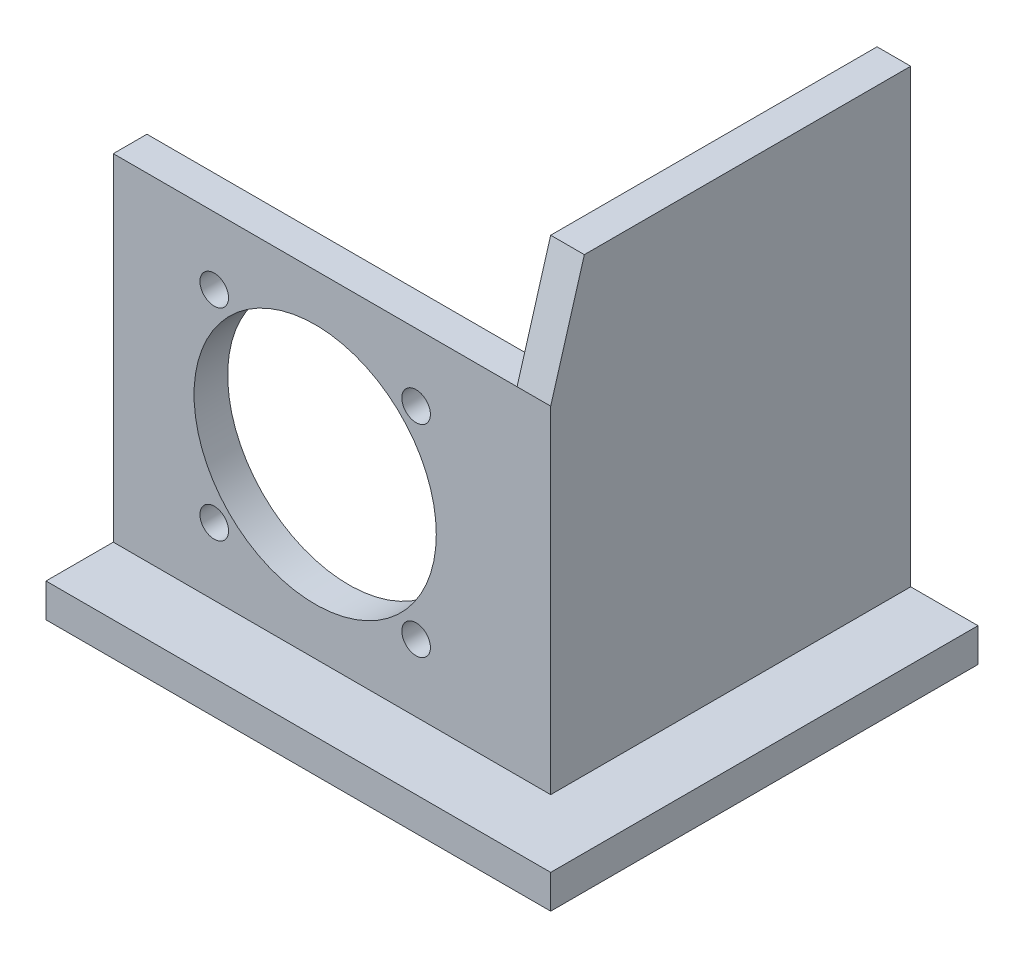
ISO-10303-21;
HEADER;
FILE_DESCRIPTION(('STEP AP214'),'2;1');
FILE_NAME('part.step','',(''),(''),'','','');
FILE_SCHEMA(('AUTOMOTIVE_DESIGN { 1 0 10303 214 1 1 1 1 }'));
ENDSEC;
DATA;
#1=APPLICATION_CONTEXT('core data for automotive mechanical design processes');
#2=APPLICATION_PROTOCOL_DEFINITION('international standard','automotive_design',2000,#1);
#3=PRODUCT_CONTEXT('',#1,'mechanical');
#4=PRODUCT('Part','Part','',(#3));
#5=PRODUCT_RELATED_PRODUCT_CATEGORY('part','',(#4));
#6=PRODUCT_DEFINITION_FORMATION('','',#4);
#7=PRODUCT_DEFINITION_CONTEXT('part definition',#1,'design');
#8=PRODUCT_DEFINITION('design','',#6,#7);
#9=PRODUCT_DEFINITION_SHAPE('','',#8);
#10=(LENGTH_UNIT() NAMED_UNIT(*) SI_UNIT(.MILLI.,.METRE.));
#11=(NAMED_UNIT(*) PLANE_ANGLE_UNIT() SI_UNIT($,.RADIAN.));
#12=(NAMED_UNIT(*) SI_UNIT($,.STERADIAN.) SOLID_ANGLE_UNIT());
#13=UNCERTAINTY_MEASURE_WITH_UNIT(LENGTH_MEASURE(1.E-05),#10,'distance_accuracy_value','');
#14=(GEOMETRIC_REPRESENTATION_CONTEXT(3) GLOBAL_UNCERTAINTY_ASSIGNED_CONTEXT((#13)) GLOBAL_UNIT_ASSIGNED_CONTEXT((#10,
#11,#12)) REPRESENTATION_CONTEXT('',''));
#15=CARTESIAN_POINT('',(0.,0.,0.));
#16=DIRECTION('',(0.,0.,1.));
#17=DIRECTION('',(1.,0.,0.));
#18=AXIS2_PLACEMENT_3D('',#15,#16,#17);
#19=CARTESIAN_POINT('',(0.,0.,10.));
#20=DIRECTION('',(0.,0.,-1.));
#21=DIRECTION('',(-1.,0.,0.));
#22=AXIS2_PLACEMENT_3D('',#19,#20,#21);
#23=PLANE('',#22);
#24=DIRECTION('',(0.,-1.,0.));
#25=VECTOR('',#24,1.);
#26=CARTESIAN_POINT('',(-90.,-90.,10.));
#27=LINE('',#26,#25);
#28=CARTESIAN_POINT('',(-90.,20.,10.));
#29=VERTEX_POINT('',#28);
#30=CARTESIAN_POINT('',(-90.,-80.,10.));
#31=VERTEX_POINT('',#30);
#32=EDGE_CURVE('E55',#29,#31,#27,.T.);
#33=ORIENTED_EDGE('',*,*,#32,.T.);
#34=DIRECTION('',(1.,0.,0.));
#35=VECTOR('',#34,1.);
#36=CARTESIAN_POINT('',(-90.,-80.,10.));
#37=LINE('',#36,#35);
#38=CARTESIAN_POINT('',(40.,-80.,10.));
#39=VERTEX_POINT('',#38);
#40=EDGE_CURVE('E154',#31,#39,#37,.T.);
#41=ORIENTED_EDGE('',*,*,#40,.T.);
#42=DIRECTION('',(0.,-1.,0.));
#43=VECTOR('',#42,1.);
#44=CARTESIAN_POINT('',(40.,-90.,10.));
#45=LINE('',#44,#43);
#46=CARTESIAN_POINT('',(40.,19.9999999999996,10.));
#47=VERTEX_POINT('',#46);
#48=EDGE_CURVE('E174',#47,#39,#45,.T.);
#49=ORIENTED_EDGE('',*,*,#48,.F.);
#50=DIRECTION('',(-1.,0.,0.));
#51=VECTOR('',#50,1.);
#52=CARTESIAN_POINT('',(0.,19.9999999999996,10.));
#53=LINE('',#52,#51);
#54=CARTESIAN_POINT('',(30.,20.,10.));
#55=VERTEX_POINT('',#54);
#56=EDGE_CURVE('E251',#47,#55,#53,.T.);
#57=ORIENTED_EDGE('',*,*,#56,.T.);
#58=DIRECTION('',(-1.,0.,0.));
#59=VECTOR('',#58,1.);
#60=CARTESIAN_POINT('',(30.,20.,10.));
#61=LINE('',#60,#59);
#62=EDGE_CURVE('E227',#55,#29,#61,.T.);
#63=ORIENTED_EDGE('',*,*,#62,.T.);
#64=EDGE_LOOP('',(#33,#41,#49,#57,#63));
#65=FACE_BOUND('',#64,.T.);
#66=CARTESIAN_POINT('',(0.,0.,10.));
#67=DIRECTION('',(0.,0.,1.));
#68=DIRECTION('',(1.,0.,0.));
#69=AXIS2_PLACEMENT_3D('',#66,#67,#68);
#70=CIRCLE('',#69,4.25);
#71=CARTESIAN_POINT('',(4.25,0.,10.));
#72=VERTEX_POINT('',#71);
#73=EDGE_CURVE('E220',#72,#72,#70,.T.);
#74=ORIENTED_EDGE('',*,*,#73,.F.);
#75=EDGE_LOOP('',(#74));
#76=FACE_BOUND('',#75,.T.);
#77=CARTESIAN_POINT('',(0.,-60.,10.));
#78=DIRECTION('',(0.,0.,1.));
#79=DIRECTION('',(1.,0.,0.));
#80=AXIS2_PLACEMENT_3D('',#77,#78,#79);
#81=CIRCLE('',#80,4.25);
#82=CARTESIAN_POINT('',(4.25,-60.,10.));
#83=VERTEX_POINT('',#82);
#84=EDGE_CURVE('E214',#83,#83,#81,.T.);
#85=ORIENTED_EDGE('',*,*,#84,.F.);
#86=EDGE_LOOP('',(#85));
#87=FACE_BOUND('',#86,.T.);
#88=CARTESIAN_POINT('',(-30.,-30.,10.));
#89=DIRECTION('',(0.,0.,1.));
#90=DIRECTION('',(1.,0.,0.));
#91=AXIS2_PLACEMENT_3D('',#88,#89,#90);
#92=CIRCLE('',#91,36.);
#93=CARTESIAN_POINT('',(6.00000000000001,-30.,10.));
#94=VERTEX_POINT('',#93);
#95=EDGE_CURVE('E207',#94,#94,#92,.T.);
#96=ORIENTED_EDGE('',*,*,#95,.F.);
#97=EDGE_LOOP('',(#96));
#98=FACE_BOUND('',#97,.T.);
#99=CARTESIAN_POINT('',(-60.,0.,10.));
#100=DIRECTION('',(0.,0.,1.));
#101=DIRECTION('',(-1.,0.,0.));
#102=AXIS2_PLACEMENT_3D('',#99,#100,#101);
#103=CIRCLE('',#102,4.25);
#104=CARTESIAN_POINT('',(-64.25,0.,10.));
#105=VERTEX_POINT('',#104);
#106=EDGE_CURVE('E201',#105,#105,#103,.T.);
#107=ORIENTED_EDGE('',*,*,#106,.F.);
#108=EDGE_LOOP('',(#107));
#109=FACE_BOUND('',#108,.T.);
#110=CARTESIAN_POINT('',(-60.,-60.,10.));
#111=DIRECTION('',(0.,0.,1.));
#112=DIRECTION('',(-1.,0.,0.));
#113=AXIS2_PLACEMENT_3D('',#110,#111,#112);
#114=CIRCLE('',#113,4.25);
#115=CARTESIAN_POINT('',(-64.25,-60.,10.));
#116=VERTEX_POINT('',#115);
#117=EDGE_CURVE('E195',#116,#116,#114,.T.);
#118=ORIENTED_EDGE('',*,*,#117,.F.);
#119=EDGE_LOOP('',(#118));
#120=FACE_BOUND('',#119,.T.);
#121=ADVANCED_FACE('F39',(#65,#76,#87,#98,#109,#120),#23,.F.);
#122=CARTESIAN_POINT('',(0.,0.,0.));
#123=DIRECTION('',(0.,0.,-1.));
#124=DIRECTION('',(-1.,0.,0.));
#125=AXIS2_PLACEMENT_3D('',#122,#123,#124);
#126=PLANE('',#125);
#127=CARTESIAN_POINT('',(-60.,0.,0.));
#128=DIRECTION('',(0.,0.,1.));
#129=DIRECTION('',(-1.,0.,0.));
#130=AXIS2_PLACEMENT_3D('',#127,#128,#129);
#131=CIRCLE('',#130,4.25);
#132=CARTESIAN_POINT('',(-64.25,0.,0.));
#133=VERTEX_POINT('',#132);
#134=EDGE_CURVE('E198',#133,#133,#131,.T.);
#135=ORIENTED_EDGE('',*,*,#134,.T.);
#136=EDGE_LOOP('',(#135));
#137=FACE_BOUND('',#136,.T.);
#138=CARTESIAN_POINT('',(0.,-60.,0.));
#139=DIRECTION('',(0.,0.,1.));
#140=DIRECTION('',(1.,0.,0.));
#141=AXIS2_PLACEMENT_3D('',#138,#139,#140);
#142=CIRCLE('',#141,4.25);
#143=CARTESIAN_POINT('',(4.25,-60.,0.));
#144=VERTEX_POINT('',#143);
#145=EDGE_CURVE('E211',#144,#144,#142,.T.);
#146=ORIENTED_EDGE('',*,*,#145,.T.);
#147=EDGE_LOOP('',(#146));
#148=FACE_BOUND('',#147,.T.);
#149=DIRECTION('',(1.,0.,0.));
#150=VECTOR('',#149,1.);
#151=CARTESIAN_POINT('',(30.,-90.,0.));
#152=LINE('',#151,#150);
#153=CARTESIAN_POINT('',(-90.,-90.,0.));
#154=VERTEX_POINT('',#153);
#155=CARTESIAN_POINT('',(30.,-90.,0.));
#156=VERTEX_POINT('',#155);
#157=EDGE_CURVE('E224',#154,#156,#152,.T.);
#158=ORIENTED_EDGE('',*,*,#157,.F.);
#159=DIRECTION('',(0.,-1.,0.));
#160=VECTOR('',#159,1.);
#161=CARTESIAN_POINT('',(-90.,-90.,0.));
#162=LINE('',#161,#160);
#163=CARTESIAN_POINT('',(-90.,20.,0.));
#164=VERTEX_POINT('',#163);
#165=EDGE_CURVE('E230',#164,#154,#162,.T.);
#166=ORIENTED_EDGE('',*,*,#165,.F.);
#167=DIRECTION('',(-1.,0.,0.));
#168=VECTOR('',#167,1.);
#169=CARTESIAN_POINT('',(30.,20.,0.));
#170=LINE('',#169,#168);
#171=CARTESIAN_POINT('',(30.,20.,0.));
#172=VERTEX_POINT('',#171);
#173=EDGE_CURVE('E238',#172,#164,#170,.T.);
#174=ORIENTED_EDGE('',*,*,#173,.F.);
#175=DIRECTION('',(0.,1.,0.));
#176=VECTOR('',#175,1.);
#177=CARTESIAN_POINT('',(30.,-90.,0.));
#178=LINE('',#177,#176);
#179=EDGE_CURVE('E235',#156,#172,#178,.T.);
#180=ORIENTED_EDGE('',*,*,#179,.F.);
#181=EDGE_LOOP('',(#158,#166,#174,#180));
#182=FACE_BOUND('',#181,.T.);
#183=CARTESIAN_POINT('',(0.,0.,0.));
#184=DIRECTION('',(0.,0.,1.));
#185=DIRECTION('',(1.,0.,0.));
#186=AXIS2_PLACEMENT_3D('',#183,#184,#185);
#187=CIRCLE('',#186,4.25);
#188=CARTESIAN_POINT('',(4.25,0.,0.));
#189=VERTEX_POINT('',#188);
#190=EDGE_CURVE('E217',#189,#189,#187,.T.);
#191=ORIENTED_EDGE('',*,*,#190,.T.);
#192=EDGE_LOOP('',(#191));
#193=FACE_BOUND('',#192,.T.);
#194=CARTESIAN_POINT('',(-30.,-30.,0.));
#195=DIRECTION('',(0.,0.,1.));
#196=DIRECTION('',(1.,0.,0.));
#197=AXIS2_PLACEMENT_3D('',#194,#195,#196);
#198=CIRCLE('',#197,36.);
#199=CARTESIAN_POINT('',(6.00000000000001,-30.,0.));
#200=VERTEX_POINT('',#199);
#201=EDGE_CURVE('E204',#200,#200,#198,.T.);
#202=ORIENTED_EDGE('',*,*,#201,.T.);
#203=EDGE_LOOP('',(#202));
#204=FACE_BOUND('',#203,.T.);
#205=CARTESIAN_POINT('',(-60.,-60.,0.));
#206=DIRECTION('',(0.,0.,1.));
#207=DIRECTION('',(-1.,0.,0.));
#208=AXIS2_PLACEMENT_3D('',#205,#206,#207);
#209=CIRCLE('',#208,4.25);
#210=CARTESIAN_POINT('',(-64.25,-60.,0.));
#211=VERTEX_POINT('',#210);
#212=EDGE_CURVE('E194',#211,#211,#209,.T.);
#213=ORIENTED_EDGE('',*,*,#212,.T.);
#214=EDGE_LOOP('',(#213));
#215=FACE_BOUND('',#214,.T.);
#216=ADVANCED_FACE('F289',(#137,#148,#182,#193,#204,#215),#126,.T.);
#217=CARTESIAN_POINT('',(30.,-90.,10.));
#218=DIRECTION('',(0.,1.,0.));
#219=DIRECTION('',(0.,0.,1.));
#220=AXIS2_PLACEMENT_3D('',#217,#218,#219);
#221=PLANE('',#220);
#222=ORIENTED_EDGE('',*,*,#157,.T.);
#223=DIRECTION('',(0.,0.,-1.));
#224=VECTOR('',#223,1.);
#225=CARTESIAN_POINT('',(30.,-90.,10.));
#226=LINE('',#225,#224);
#227=CARTESIAN_POINT('',(30.,-90.,-97.));
#228=VERTEX_POINT('',#227);
#229=EDGE_CURVE('E171',#156,#228,#226,.T.);
#230=ORIENTED_EDGE('',*,*,#229,.T.);
#231=DIRECTION('',(-1.,0.,0.));
#232=VECTOR('',#231,1.);
#233=CARTESIAN_POINT('',(40.,-90.,-97.));
#234=LINE('',#233,#232);
#235=CARTESIAN_POINT('',(60.,-90.,-97.));
#236=VERTEX_POINT('',#235);
#237=EDGE_CURVE('E192',#236,#228,#234,.T.);
#238=ORIENTED_EDGE('',*,*,#237,.F.);
#239=DIRECTION('',(0.,0.,1.));
#240=VECTOR('',#239,1.);
#241=CARTESIAN_POINT('',(60.,-90.,30.));
#242=LINE('',#241,#240);
#243=CARTESIAN_POINT('',(60.,-90.,30.));
#244=VERTEX_POINT('',#243);
#245=EDGE_CURVE('E133',#236,#244,#242,.T.);
#246=ORIENTED_EDGE('',*,*,#245,.T.);
#247=DIRECTION('',(-1.,0.,0.));
#248=VECTOR('',#247,1.);
#249=CARTESIAN_POINT('',(-90.,-90.,30.));
#250=LINE('',#249,#248);
#251=CARTESIAN_POINT('',(-90.,-90.,30.));
#252=VERTEX_POINT('',#251);
#253=EDGE_CURVE('E164',#244,#252,#250,.T.);
#254=ORIENTED_EDGE('',*,*,#253,.T.);
#255=DIRECTION('',(0.,0.,-1.));
#256=VECTOR('',#255,1.);
#257=CARTESIAN_POINT('',(-90.,-90.,10.));
#258=LINE('',#257,#256);
#259=EDGE_CURVE('E232',#252,#154,#258,.T.);
#260=ORIENTED_EDGE('',*,*,#259,.T.);
#261=EDGE_LOOP('',(#222,#230,#238,#246,#254,#260));
#262=FACE_BOUND('',#261,.T.);
#263=ADVANCED_FACE('F285',(#262),#221,.F.);
#264=CARTESIAN_POINT('',(30.,20.,10.));
#265=DIRECTION('',(0.,-1.,0.));
#266=DIRECTION('',(0.,0.,-1.));
#267=AXIS2_PLACEMENT_3D('',#264,#265,#266);
#268=PLANE('',#267);
#269=ORIENTED_EDGE('',*,*,#173,.T.);
#270=DIRECTION('',(0.,0.,-1.));
#271=VECTOR('',#270,1.);
#272=CARTESIAN_POINT('',(-90.,20.,10.));
#273=LINE('',#272,#271);
#274=EDGE_CURVE('E244',#29,#164,#273,.T.);
#275=ORIENTED_EDGE('',*,*,#274,.F.);
#276=ORIENTED_EDGE('',*,*,#62,.F.);
#277=DIRECTION('',(0.,0.,-1.));
#278=VECTOR('',#277,1.);
#279=CARTESIAN_POINT('',(30.,20.,10.));
#280=LINE('',#279,#278);
#281=EDGE_CURVE('E247',#55,#172,#280,.T.);
#282=ORIENTED_EDGE('',*,*,#281,.T.);
#283=EDGE_LOOP('',(#269,#275,#276,#282));
#284=FACE_BOUND('',#283,.T.);
#285=ADVANCED_FACE('F277',(#284),#268,.F.);
#286=CARTESIAN_POINT('',(-90.,-90.,10.));
#287=DIRECTION('',(1.,0.,0.));
#288=DIRECTION('',(0.,0.,-1.));
#289=AXIS2_PLACEMENT_3D('',#286,#287,#288);
#290=PLANE('',#289);
#291=ORIENTED_EDGE('',*,*,#165,.T.);
#292=ORIENTED_EDGE('',*,*,#259,.F.);
#293=DIRECTION('',(0.,-1.,0.));
#294=VECTOR('',#293,1.);
#295=CARTESIAN_POINT('',(-90.,-80.,30.));
#296=LINE('',#295,#294);
#297=CARTESIAN_POINT('',(-90.,-80.,30.));
#298=VERTEX_POINT('',#297);
#299=EDGE_CURVE('E168',#298,#252,#296,.T.);
#300=ORIENTED_EDGE('',*,*,#299,.F.);
#301=DIRECTION('',(0.,0.,-1.));
#302=VECTOR('',#301,1.);
#303=CARTESIAN_POINT('',(-90.,-80.,30.));
#304=LINE('',#303,#302);
#305=EDGE_CURVE('E138',#298,#31,#304,.T.);
#306=ORIENTED_EDGE('',*,*,#305,.T.);
#307=ORIENTED_EDGE('',*,*,#32,.F.);
#308=ORIENTED_EDGE('',*,*,#274,.T.);
#309=EDGE_LOOP('',(#291,#292,#300,#306,#307,#308));
#310=FACE_BOUND('',#309,.T.);
#311=ADVANCED_FACE('F280',(#310),#290,.F.);
#312=CARTESIAN_POINT('',(0.,0.,10.));
#313=DIRECTION('',(0.,0.,-1.));
#314=DIRECTION('',(-1.,0.,0.));
#315=AXIS2_PLACEMENT_3D('',#312,#313,#314);
#316=CYLINDRICAL_SURFACE('',#315,4.25);
#317=ORIENTED_EDGE('',*,*,#73,.T.);
#318=EDGE_LOOP('',(#317));
#319=FACE_BOUND('',#318,.T.);
#320=ORIENTED_EDGE('',*,*,#190,.F.);
#321=EDGE_LOOP('',(#320));
#322=FACE_BOUND('',#321,.T.);
#323=ADVANCED_FACE('F318',(#319,#322),#316,.F.);
#324=CARTESIAN_POINT('',(0.,-60.,10.));
#325=DIRECTION('',(0.,0.,-1.));
#326=DIRECTION('',(-1.,0.,0.));
#327=AXIS2_PLACEMENT_3D('',#324,#325,#326);
#328=CYLINDRICAL_SURFACE('',#327,4.25);
#329=ORIENTED_EDGE('',*,*,#84,.T.);
#330=EDGE_LOOP('',(#329));
#331=FACE_BOUND('',#330,.T.);
#332=ORIENTED_EDGE('',*,*,#145,.F.);
#333=EDGE_LOOP('',(#332));
#334=FACE_BOUND('',#333,.T.);
#335=ADVANCED_FACE('F347',(#331,#334),#328,.F.);
#336=CARTESIAN_POINT('',(-30.,-30.,10.));
#337=DIRECTION('',(0.,0.,-1.));
#338=DIRECTION('',(-1.,0.,0.));
#339=AXIS2_PLACEMENT_3D('',#336,#337,#338);
#340=CYLINDRICAL_SURFACE('',#339,36.);
#341=ORIENTED_EDGE('',*,*,#95,.T.);
#342=EDGE_LOOP('',(#341));
#343=FACE_BOUND('',#342,.T.);
#344=ORIENTED_EDGE('',*,*,#201,.F.);
#345=EDGE_LOOP('',(#344));
#346=FACE_BOUND('',#345,.T.);
#347=ADVANCED_FACE('F310',(#343,#346),#340,.F.);
#348=CARTESIAN_POINT('',(-60.,0.,10.));
#349=DIRECTION('',(0.,0.,-1.));
#350=DIRECTION('',(-1.,0.,0.));
#351=AXIS2_PLACEMENT_3D('',#348,#349,#350);
#352=CYLINDRICAL_SURFACE('',#351,4.25);
#353=ORIENTED_EDGE('',*,*,#106,.T.);
#354=EDGE_LOOP('',(#353));
#355=FACE_BOUND('',#354,.T.);
#356=ORIENTED_EDGE('',*,*,#134,.F.);
#357=EDGE_LOOP('',(#356));
#358=FACE_BOUND('',#357,.T.);
#359=ADVANCED_FACE('F302',(#355,#358),#352,.F.);
#360=CARTESIAN_POINT('',(-60.,-60.,10.));
#361=DIRECTION('',(0.,0.,-1.));
#362=DIRECTION('',(-1.,0.,0.));
#363=AXIS2_PLACEMENT_3D('',#360,#361,#362);
#364=CYLINDRICAL_SURFACE('',#363,4.25);
#365=ORIENTED_EDGE('',*,*,#117,.T.);
#366=EDGE_LOOP('',(#365));
#367=FACE_BOUND('',#366,.T.);
#368=ORIENTED_EDGE('',*,*,#212,.F.);
#369=EDGE_LOOP('',(#368));
#370=FACE_BOUND('',#369,.T.);
#371=ADVANCED_FACE('F300',(#367,#370),#364,.F.);
#372=CARTESIAN_POINT('',(40.,-90.,-97.));
#373=DIRECTION('',(0.,0.,1.));
#374=DIRECTION('',(1.,0.,0.));
#375=AXIS2_PLACEMENT_3D('',#372,#373,#374);
#376=PLANE('',#375);
#377=DIRECTION('',(0.,1.,0.));
#378=VECTOR('',#377,1.);
#379=CARTESIAN_POINT('',(30.,-90.,-97.));
#380=LINE('',#379,#378);
#381=CARTESIAN_POINT('',(30.,54.,-97.));
#382=VERTEX_POINT('',#381);
#383=EDGE_CURVE('E185',#228,#382,#380,.T.);
#384=ORIENTED_EDGE('',*,*,#383,.T.);
#385=DIRECTION('',(-1.,0.,0.));
#386=VECTOR('',#385,1.);
#387=CARTESIAN_POINT('',(40.,54.,-97.));
#388=LINE('',#387,#386);
#389=CARTESIAN_POINT('',(40.,54.,-97.));
#390=VERTEX_POINT('',#389);
#391=EDGE_CURVE('E183',#390,#382,#388,.T.);
#392=ORIENTED_EDGE('',*,*,#391,.F.);
#393=DIRECTION('',(0.,1.,0.));
#394=VECTOR('',#393,1.);
#395=CARTESIAN_POINT('',(40.,-90.,-97.));
#396=LINE('',#395,#394);
#397=CARTESIAN_POINT('',(40.,-80.,-97.));
#398=VERTEX_POINT('',#397);
#399=EDGE_CURVE('E152',#398,#390,#396,.T.);
#400=ORIENTED_EDGE('',*,*,#399,.F.);
#401=DIRECTION('',(1.,0.,0.));
#402=VECTOR('',#401,1.);
#403=CARTESIAN_POINT('',(40.,-80.,-97.));
#404=LINE('',#403,#402);
#405=CARTESIAN_POINT('',(60.,-80.,-97.));
#406=VERTEX_POINT('',#405);
#407=EDGE_CURVE('E144',#398,#406,#404,.T.);
#408=ORIENTED_EDGE('',*,*,#407,.T.);
#409=DIRECTION('',(0.,-1.,0.));
#410=VECTOR('',#409,1.);
#411=CARTESIAN_POINT('',(60.,-80.,-97.));
#412=LINE('',#411,#410);
#413=EDGE_CURVE('E128',#406,#236,#412,.T.);
#414=ORIENTED_EDGE('',*,*,#413,.T.);
#415=ORIENTED_EDGE('',*,*,#237,.T.);
#416=EDGE_LOOP('',(#384,#392,#400,#408,#414,#415));
#417=FACE_BOUND('',#416,.T.);
#418=ADVANCED_FACE('F150',(#417),#376,.F.);
#419=CARTESIAN_POINT('',(40.,54.,10.));
#420=DIRECTION('',(0.,-1.,0.));
#421=DIRECTION('',(1.,0.,0.));
#422=AXIS2_PLACEMENT_3D('',#419,#420,#421);
#423=PLANE('',#422);
#424=DIRECTION('',(0.,0.,1.));
#425=VECTOR('',#424,1.);
#426=CARTESIAN_POINT('',(30.,54.,10.));
#427=LINE('',#426,#425);
#428=CARTESIAN_POINT('',(30.,54.,0.));
#429=VERTEX_POINT('',#428);
#430=EDGE_CURVE('E177',#382,#429,#427,.T.);
#431=ORIENTED_EDGE('',*,*,#430,.T.);
#432=DIRECTION('',(1.,0.,0.));
#433=VECTOR('',#432,1.);
#434=CARTESIAN_POINT('',(40.,54.,0.));
#435=LINE('',#434,#433);
#436=CARTESIAN_POINT('',(40.,54.,0.));
#437=VERTEX_POINT('',#436);
#438=EDGE_CURVE('E48',#429,#437,#435,.T.);
#439=ORIENTED_EDGE('',*,*,#438,.T.);
#440=DIRECTION('',(0.,0.,1.));
#441=VECTOR('',#440,1.);
#442=CARTESIAN_POINT('',(40.,54.,10.));
#443=LINE('',#442,#441);
#444=EDGE_CURVE('E179',#390,#437,#443,.T.);
#445=ORIENTED_EDGE('',*,*,#444,.F.);
#446=ORIENTED_EDGE('',*,*,#391,.T.);
#447=EDGE_LOOP('',(#431,#439,#445,#446));
#448=FACE_BOUND('',#447,.T.);
#449=ADVANCED_FACE('F261',(#448),#423,.F.);
#450=CARTESIAN_POINT('',(40.,0.,0.));
#451=DIRECTION('',(-1.,0.,0.));
#452=DIRECTION('',(0.,-1.,0.));
#453=AXIS2_PLACEMENT_3D('',#450,#451,#452);
#454=PLANE('',#453);
#455=ORIENTED_EDGE('',*,*,#48,.T.);
#456=DIRECTION('',(0.,0.,-1.));
#457=VECTOR('',#456,1.);
#458=CARTESIAN_POINT('',(40.,-80.,10.));
#459=LINE('',#458,#457);
#460=EDGE_CURVE('E63',#39,#398,#459,.T.);
#461=ORIENTED_EDGE('',*,*,#460,.T.);
#462=ORIENTED_EDGE('',*,*,#399,.T.);
#463=ORIENTED_EDGE('',*,*,#444,.T.);
#464=DIRECTION('',(0.,0.959365501571271,-0.282166323991547));
#465=VECTOR('',#464,1.);
#466=CARTESIAN_POINT('',(40.,19.9999999999996,10.));
#467=LINE('',#466,#465);
#468=EDGE_CURVE('E11',#437,#47,#467,.F.);
#469=ORIENTED_EDGE('',*,*,#468,.T.);
#470=EDGE_LOOP('',(#455,#461,#462,#463,#469));
#471=FACE_BOUND('',#470,.T.);
#472=ADVANCED_FACE('F265',(#471),#454,.F.);
#473=CARTESIAN_POINT('',(30.,0.,0.));
#474=DIRECTION('',(-1.,0.,0.));
#475=DIRECTION('',(0.,-1.,0.));
#476=AXIS2_PLACEMENT_3D('',#473,#474,#475);
#477=PLANE('',#476);
#478=ORIENTED_EDGE('',*,*,#281,.F.);
#479=DIRECTION('',(0.,-0.959365501571271,0.282166323991547));
#480=VECTOR('',#479,1.);
#481=CARTESIAN_POINT('',(30.,4.29936305732475,14.6178343949043));
#482=LINE('',#481,#480);
#483=EDGE_CURVE('E255',#55,#429,#482,.F.);
#484=ORIENTED_EDGE('',*,*,#483,.T.);
#485=ORIENTED_EDGE('',*,*,#430,.F.);
#486=ORIENTED_EDGE('',*,*,#383,.F.);
#487=ORIENTED_EDGE('',*,*,#229,.F.);
#488=ORIENTED_EDGE('',*,*,#179,.T.);
#489=EDGE_LOOP('',(#478,#484,#485,#486,#487,#488));
#490=FACE_BOUND('',#489,.T.);
#491=ADVANCED_FACE('F273',(#490),#477,.T.);
#492=CARTESIAN_POINT('',(0.,19.9999999999996,10.));
#493=DIRECTION('',(0.,-0.282166323991547,-0.959365501571271));
#494=DIRECTION('',(-1.,0.,0.));
#495=AXIS2_PLACEMENT_3D('',#492,#493,#494);
#496=PLANE('',#495);
#497=ORIENTED_EDGE('',*,*,#468,.F.);
#498=ORIENTED_EDGE('',*,*,#438,.F.);
#499=ORIENTED_EDGE('',*,*,#483,.F.);
#500=ORIENTED_EDGE('',*,*,#56,.F.);
#501=EDGE_LOOP('',(#497,#498,#499,#500));
#502=FACE_BOUND('',#501,.T.);
#503=ADVANCED_FACE('F41',(#502),#496,.F.);
#504=CARTESIAN_POINT('',(-90.,-80.,30.));
#505=DIRECTION('',(0.,0.,1.));
#506=DIRECTION('',(1.,0.,0.));
#507=AXIS2_PLACEMENT_3D('',#504,#505,#506);
#508=PLANE('',#507);
#509=ORIENTED_EDGE('',*,*,#253,.F.);
#510=DIRECTION('',(0.,-1.,0.));
#511=VECTOR('',#510,1.);
#512=CARTESIAN_POINT('',(60.,-80.,30.));
#513=LINE('',#512,#511);
#514=CARTESIAN_POINT('',(60.,-80.,30.));
#515=VERTEX_POINT('',#514);
#516=EDGE_CURVE('E137',#515,#244,#513,.T.);
#517=ORIENTED_EDGE('',*,*,#516,.F.);
#518=DIRECTION('',(-1.,0.,0.));
#519=VECTOR('',#518,1.);
#520=CARTESIAN_POINT('',(-90.,-80.,30.));
#521=LINE('',#520,#519);
#522=EDGE_CURVE('E147',#515,#298,#521,.T.);
#523=ORIENTED_EDGE('',*,*,#522,.T.);
#524=ORIENTED_EDGE('',*,*,#299,.T.);
#525=EDGE_LOOP('',(#509,#517,#523,#524));
#526=FACE_BOUND('',#525,.T.);
#527=ADVANCED_FACE('F283',(#526),#508,.T.);
#528=CARTESIAN_POINT('',(60.,-80.,30.));
#529=DIRECTION('',(1.,0.,0.));
#530=DIRECTION('',(0.,0.,-1.));
#531=AXIS2_PLACEMENT_3D('',#528,#529,#530);
#532=PLANE('',#531);
#533=ORIENTED_EDGE('',*,*,#245,.F.);
#534=ORIENTED_EDGE('',*,*,#413,.F.);
#535=DIRECTION('',(0.,0.,1.));
#536=VECTOR('',#535,1.);
#537=CARTESIAN_POINT('',(60.,-80.,30.));
#538=LINE('',#537,#536);
#539=EDGE_CURVE('E131',#406,#515,#538,.T.);
#540=ORIENTED_EDGE('',*,*,#539,.T.);
#541=ORIENTED_EDGE('',*,*,#516,.T.);
#542=EDGE_LOOP('',(#533,#534,#540,#541));
#543=FACE_BOUND('',#542,.T.);
#544=ADVANCED_FACE('F130',(#543),#532,.T.);
#545=CARTESIAN_POINT('',(0.,-80.,0.));
#546=DIRECTION('',(0.,1.,0.));
#547=DIRECTION('',(0.,0.,1.));
#548=AXIS2_PLACEMENT_3D('',#545,#546,#547);
#549=PLANE('',#548);
#550=ORIENTED_EDGE('',*,*,#40,.F.);
#551=ORIENTED_EDGE('',*,*,#305,.F.);
#552=ORIENTED_EDGE('',*,*,#522,.F.);
#553=ORIENTED_EDGE('',*,*,#539,.F.);
#554=ORIENTED_EDGE('',*,*,#407,.F.);
#555=ORIENTED_EDGE('',*,*,#460,.F.);
#556=EDGE_LOOP('',(#550,#551,#552,#553,#554,#555));
#557=FACE_BOUND('',#556,.T.);
#558=ADVANCED_FACE('F143',(#557),#549,.T.);
#559=CLOSED_SHELL('',(#121,#216,#263,#285,#311,#323,#335,#347,#359,#371,#418,#449,#472,#491,
#503,#527,#544,#558));
#560=MANIFOLD_SOLID_BREP('B2',#559);
#561=ADVANCED_BREP_SHAPE_REPRESENTATION('',(#18,#560),#14);
#562=SHAPE_DEFINITION_REPRESENTATION(#9,#561);
ENDSEC;
END-ISO-10303-21;
